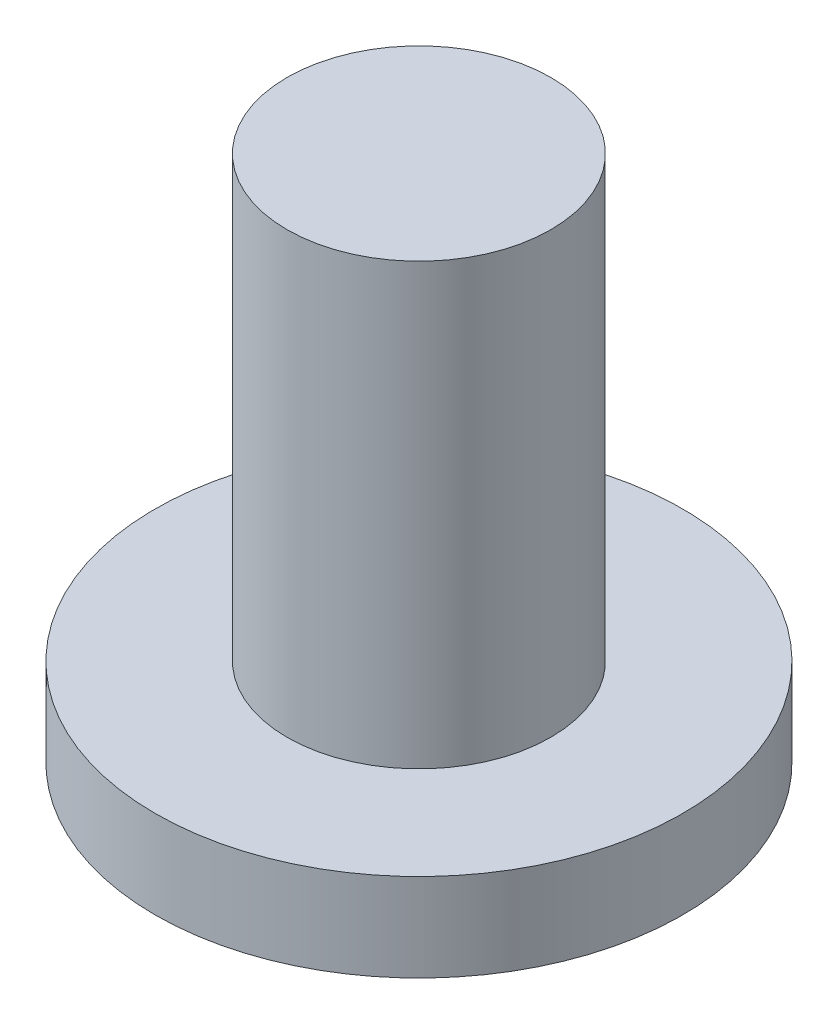
ISO-10303-21;
HEADER;
FILE_DESCRIPTION(('STEP AP214'),'2;1');
FILE_NAME('part.step','',(''),(''),'','','');
FILE_SCHEMA(('AUTOMOTIVE_DESIGN { 1 0 10303 214 1 1 1 1 }'));
ENDSEC;
DATA;
#1=APPLICATION_CONTEXT('core data for automotive mechanical design processes');
#2=APPLICATION_PROTOCOL_DEFINITION('international standard','automotive_design',2000,#1);
#3=PRODUCT_CONTEXT('',#1,'mechanical');
#4=PRODUCT('Part','Part','',(#3));
#5=PRODUCT_RELATED_PRODUCT_CATEGORY('part','',(#4));
#6=PRODUCT_DEFINITION_FORMATION('','',#4);
#7=PRODUCT_DEFINITION_CONTEXT('part definition',#1,'design');
#8=PRODUCT_DEFINITION('design','',#6,#7);
#9=PRODUCT_DEFINITION_SHAPE('','',#8);
#10=(LENGTH_UNIT() NAMED_UNIT(*) SI_UNIT(.MILLI.,.METRE.));
#11=(NAMED_UNIT(*) PLANE_ANGLE_UNIT() SI_UNIT($,.RADIAN.));
#12=(NAMED_UNIT(*) SI_UNIT($,.STERADIAN.) SOLID_ANGLE_UNIT());
#13=UNCERTAINTY_MEASURE_WITH_UNIT(LENGTH_MEASURE(1.E-05),#10,'distance_accuracy_value','');
#14=(GEOMETRIC_REPRESENTATION_CONTEXT(3) GLOBAL_UNCERTAINTY_ASSIGNED_CONTEXT((#13)) GLOBAL_UNIT_ASSIGNED_CONTEXT((#10,
#11,#12)) REPRESENTATION_CONTEXT('',''));
#15=CARTESIAN_POINT('',(0.,0.,0.));
#16=DIRECTION('',(0.,0.,1.));
#17=DIRECTION('',(1.,0.,0.));
#18=AXIS2_PLACEMENT_3D('',#15,#16,#17);
#19=CARTESIAN_POINT('',(0.,2.,0.));
#20=DIRECTION('',(0.,-1.,0.));
#21=DIRECTION('',(0.,0.,-1.));
#22=AXIS2_PLACEMENT_3D('',#19,#20,#21);
#23=CYLINDRICAL_SURFACE('',#22,6.);
#24=CARTESIAN_POINT('',(0.,2.,0.));
#25=DIRECTION('',(0.,1.,0.));
#26=DIRECTION('',(0.,0.,1.));
#27=AXIS2_PLACEMENT_3D('',#24,#25,#26);
#28=CIRCLE('',#27,6.);
#29=CARTESIAN_POINT('',(0.,2.,6.));
#30=VERTEX_POINT('',#29);
#31=EDGE_CURVE('E44',#30,#30,#28,.T.);
#32=ORIENTED_EDGE('',*,*,#31,.F.);
#33=EDGE_LOOP('',(#32));
#34=FACE_BOUND('',#33,.T.);
#35=CARTESIAN_POINT('',(0.,0.,0.));
#36=DIRECTION('',(0.,1.,0.));
#37=DIRECTION('',(0.,0.,1.));
#38=AXIS2_PLACEMENT_3D('',#35,#36,#37);
#39=CIRCLE('',#38,6.);
#40=CARTESIAN_POINT('',(0.,0.,6.));
#41=VERTEX_POINT('',#40);
#42=EDGE_CURVE('E40',#41,#41,#39,.T.);
#43=ORIENTED_EDGE('',*,*,#42,.T.);
#44=EDGE_LOOP('',(#43));
#45=FACE_BOUND('',#44,.T.);
#46=ADVANCED_FACE('F37',(#34,#45),#23,.T.);
#47=CARTESIAN_POINT('',(0.,2.,0.));
#48=DIRECTION('',(0.,1.,0.));
#49=DIRECTION('',(0.,0.,1.));
#50=AXIS2_PLACEMENT_3D('',#47,#48,#49);
#51=PLANE('',#50);
#52=CARTESIAN_POINT('',(0.,2.,0.));
#53=DIRECTION('',(0.,1.,0.));
#54=DIRECTION('',(0.,0.,1.));
#55=AXIS2_PLACEMENT_3D('',#52,#53,#54);
#56=CIRCLE('',#55,3.);
#57=CARTESIAN_POINT('',(0.,2.,3.));
#58=VERTEX_POINT('',#57);
#59=EDGE_CURVE('E10',#58,#58,#56,.T.);
#60=ORIENTED_EDGE('',*,*,#59,.F.);
#61=EDGE_LOOP('',(#60));
#62=FACE_BOUND('',#61,.T.);
#63=ORIENTED_EDGE('',*,*,#31,.T.);
#64=EDGE_LOOP('',(#63));
#65=FACE_BOUND('',#64,.T.);
#66=ADVANCED_FACE('F61',(#62,#65),#51,.T.);
#67=CARTESIAN_POINT('',(0.,0.,0.));
#68=DIRECTION('',(0.,1.,0.));
#69=DIRECTION('',(0.,0.,1.));
#70=AXIS2_PLACEMENT_3D('',#67,#68,#69);
#71=PLANE('',#70);
#72=ORIENTED_EDGE('',*,*,#42,.F.);
#73=EDGE_LOOP('',(#72));
#74=FACE_BOUND('',#73,.T.);
#75=ADVANCED_FACE('F58',(#74),#71,.F.);
#76=CARTESIAN_POINT('',(0.,12.,0.));
#77=DIRECTION('',(0.,-1.,0.));
#78=DIRECTION('',(0.,0.,-1.));
#79=AXIS2_PLACEMENT_3D('',#76,#77,#78);
#80=CYLINDRICAL_SURFACE('',#79,3.);
#81=CARTESIAN_POINT('',(0.,12.,0.));
#82=DIRECTION('',(0.,1.,0.));
#83=DIRECTION('',(0.,0.,1.));
#84=AXIS2_PLACEMENT_3D('',#81,#82,#83);
#85=CIRCLE('',#84,3.);
#86=CARTESIAN_POINT('',(0.,12.,3.));
#87=VERTEX_POINT('',#86);
#88=EDGE_CURVE('E50',#87,#87,#85,.T.);
#89=ORIENTED_EDGE('',*,*,#88,.F.);
#90=EDGE_LOOP('',(#89));
#91=FACE_BOUND('',#90,.T.);
#92=ORIENTED_EDGE('',*,*,#59,.T.);
#93=EDGE_LOOP('',(#92));
#94=FACE_BOUND('',#93,.T.);
#95=ADVANCED_FACE('F60',(#91,#94),#80,.T.);
#96=CARTESIAN_POINT('',(0.,12.,0.));
#97=DIRECTION('',(0.,1.,0.));
#98=DIRECTION('',(0.,0.,1.));
#99=AXIS2_PLACEMENT_3D('',#96,#97,#98);
#100=PLANE('',#99);
#101=ORIENTED_EDGE('',*,*,#88,.T.);
#102=EDGE_LOOP('',(#101));
#103=FACE_BOUND('',#102,.T.);
#104=ADVANCED_FACE('F66',(#103),#100,.T.);
#105=CLOSED_SHELL('',(#46,#66,#75,#95,#104));
#106=MANIFOLD_SOLID_BREP('B2',#105);
#107=ADVANCED_BREP_SHAPE_REPRESENTATION('',(#18,#106),#14);
#108=SHAPE_DEFINITION_REPRESENTATION(#9,#107);
ENDSEC;
END-ISO-10303-21;
